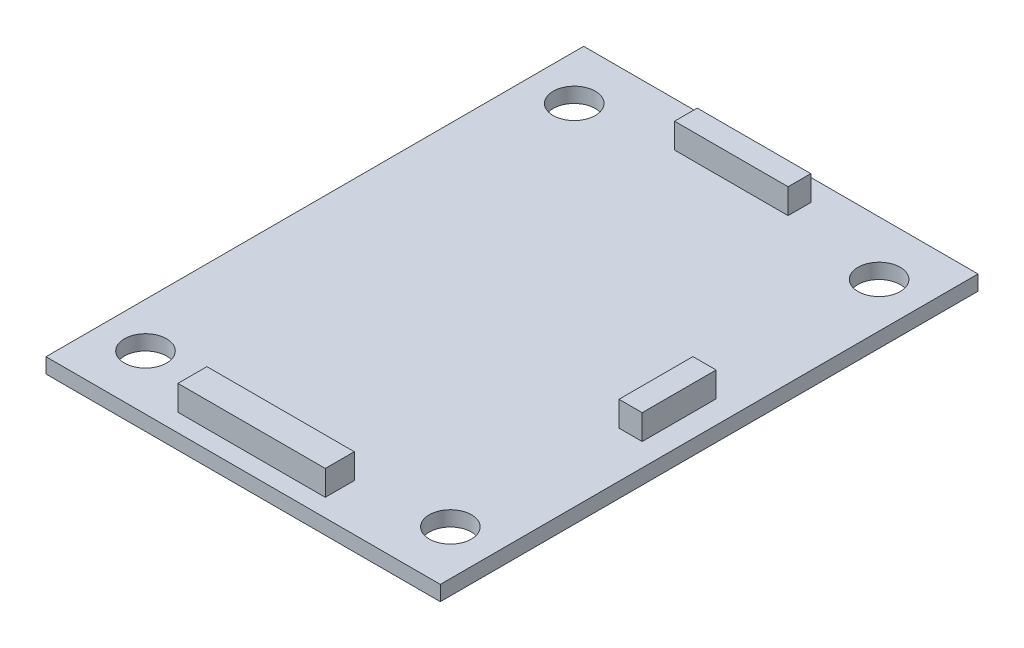
ISO-10303-21;
HEADER;
FILE_DESCRIPTION(('STEP AP214'),'2;1');
FILE_NAME('part.step','',(''),(''),'','','');
FILE_SCHEMA(('AUTOMOTIVE_DESIGN { 1 0 10303 214 1 1 1 1 }'));
ENDSEC;
DATA;
#1=APPLICATION_CONTEXT('core data for automotive mechanical design processes');
#2=APPLICATION_PROTOCOL_DEFINITION('international standard','automotive_design',2000,#1);
#3=PRODUCT_CONTEXT('',#1,'mechanical');
#4=PRODUCT('Part','Part','',(#3));
#5=PRODUCT_RELATED_PRODUCT_CATEGORY('part','',(#4));
#6=PRODUCT_DEFINITION_FORMATION('','',#4);
#7=PRODUCT_DEFINITION_CONTEXT('part definition',#1,'design');
#8=PRODUCT_DEFINITION('design','',#6,#7);
#9=PRODUCT_DEFINITION_SHAPE('','',#8);
#10=(LENGTH_UNIT() NAMED_UNIT(*) SI_UNIT(.MILLI.,.METRE.));
#11=(NAMED_UNIT(*) PLANE_ANGLE_UNIT() SI_UNIT($,.RADIAN.));
#12=(NAMED_UNIT(*) SI_UNIT($,.STERADIAN.) SOLID_ANGLE_UNIT());
#13=UNCERTAINTY_MEASURE_WITH_UNIT(LENGTH_MEASURE(1.E-05),#10,'distance_accuracy_value','');
#14=(GEOMETRIC_REPRESENTATION_CONTEXT(3) GLOBAL_UNCERTAINTY_ASSIGNED_CONTEXT((#13)) GLOBAL_UNIT_ASSIGNED_CONTEXT((#10,
#11,#12)) REPRESENTATION_CONTEXT('',''));
#15=CARTESIAN_POINT('',(0.,0.,0.));
#16=DIRECTION('',(0.,0.,1.));
#17=DIRECTION('',(1.,0.,0.));
#18=AXIS2_PLACEMENT_3D('',#15,#16,#17);
#19=CARTESIAN_POINT('',(0.,1.2,0.));
#20=DIRECTION('',(0.,1.,0.));
#21=DIRECTION('',(0.,0.,1.));
#22=AXIS2_PLACEMENT_3D('',#19,#20,#21);
#23=PLANE('',#22);
#24=CARTESIAN_POINT('',(24.3699999999999,1.2,-34.27));
#25=DIRECTION('',(0.,1.,0.));
#26=DIRECTION('',(0.,0.,1.));
#27=AXIS2_PLACEMENT_3D('',#24,#25,#26);
#28=CIRCLE('',#27,1.685);
#29=CARTESIAN_POINT('',(24.3699999999999,1.2,-32.585));
#30=VERTEX_POINT('',#29);
#31=EDGE_CURVE('E239',#30,#30,#28,.T.);
#32=ORIENTED_EDGE('',*,*,#31,.F.);
#33=EDGE_LOOP('',(#32));
#34=FACE_BOUND('',#33,.T.);
#35=CARTESIAN_POINT('',(0.,1.2,0.));
#36=DIRECTION('',(0.,1.,0.));
#37=DIRECTION('',(0.,0.,1.));
#38=AXIS2_PLACEMENT_3D('',#35,#36,#37);
#39=CIRCLE('',#38,1.685);
#40=CARTESIAN_POINT('',(0.,1.2,1.685));
#41=VERTEX_POINT('',#40);
#42=EDGE_CURVE('E251',#41,#41,#39,.T.);
#43=ORIENTED_EDGE('',*,*,#42,.F.);
#44=EDGE_LOOP('',(#43));
#45=FACE_BOUND('',#44,.T.);
#46=DIRECTION('',(0.,0.,1.));
#47=VECTOR('',#46,1.);
#48=CARTESIAN_POINT('',(-3.57247211098827,1.2,-38.5992559615219));
#49=LINE('',#48,#47);
#50=CARTESIAN_POINT('',(-3.57247211098827,1.2,-38.5992559615219));
#51=VERTEX_POINT('',#50);
#52=CARTESIAN_POINT('',(-3.57247211098827,1.2,4.38050364655458));
#53=VERTEX_POINT('',#52);
#54=EDGE_CURVE('E257',#51,#53,#49,.T.);
#55=ORIENTED_EDGE('',*,*,#54,.T.);
#56=DIRECTION('',(1.,0.,0.));
#57=VECTOR('',#56,1.);
#58=CARTESIAN_POINT('',(-3.57247211098827,1.2,4.38050364655458));
#59=LINE('',#58,#57);
#60=CARTESIAN_POINT('',(27.9460182682678,1.2,4.38050364655458));
#61=VERTEX_POINT('',#60);
#62=EDGE_CURVE('E260',#53,#61,#59,.T.);
#63=ORIENTED_EDGE('',*,*,#62,.T.);
#64=DIRECTION('',(0.,0.,-1.));
#65=VECTOR('',#64,1.);
#66=CARTESIAN_POINT('',(27.9460182682678,1.2,-38.5992559615219));
#67=LINE('',#66,#65);
#68=CARTESIAN_POINT('',(27.9460182682678,1.2,-38.5992559615219));
#69=VERTEX_POINT('',#68);
#70=EDGE_CURVE('E263',#61,#69,#67,.T.);
#71=ORIENTED_EDGE('',*,*,#70,.T.);
#72=DIRECTION('',(-1.,0.,0.));
#73=VECTOR('',#72,1.);
#74=CARTESIAN_POINT('',(-3.57247211098827,1.2,-38.5992559615219));
#75=LINE('',#74,#73);
#76=EDGE_CURVE('E265',#69,#51,#75,.T.);
#77=ORIENTED_EDGE('',*,*,#76,.T.);
#78=EDGE_LOOP('',(#55,#63,#71,#77));
#79=FACE_BOUND('',#78,.T.);
#80=CARTESIAN_POINT('',(24.37,1.2,0.));
#81=DIRECTION('',(0.,1.,0.));
#82=DIRECTION('',(0.,0.,1.));
#83=AXIS2_PLACEMENT_3D('',#80,#81,#82);
#84=CIRCLE('',#83,1.685);
#85=CARTESIAN_POINT('',(24.37,1.2,1.685));
#86=VERTEX_POINT('',#85);
#87=EDGE_CURVE('E245',#86,#86,#84,.T.);
#88=ORIENTED_EDGE('',*,*,#87,.F.);
#89=EDGE_LOOP('',(#88));
#90=FACE_BOUND('',#89,.T.);
#91=CARTESIAN_POINT('',(-1.17554633191815E-13,1.2,-34.27));
#92=DIRECTION('',(0.,1.,0.));
#93=DIRECTION('',(0.,0.,1.));
#94=AXIS2_PLACEMENT_3D('',#91,#92,#93);
#95=CIRCLE('',#94,1.685);
#96=CARTESIAN_POINT('',(-1.17554633191815E-13,1.2,-32.585));
#97=VERTEX_POINT('',#96);
#98=EDGE_CURVE('E233',#97,#97,#95,.T.);
#99=ORIENTED_EDGE('',*,*,#98,.F.);
#100=EDGE_LOOP('',(#99));
#101=FACE_BOUND('',#100,.T.);
#102=DIRECTION('',(1.,0.,0.));
#103=VECTOR('',#102,1.);
#104=CARTESIAN_POINT('',(7.2440065233413,1.2,-35.0462126022973));
#105=LINE('',#104,#103);
#106=CARTESIAN_POINT('',(7.2440065233413,1.2,-35.0462126022973));
#107=VERTEX_POINT('',#106);
#108=CARTESIAN_POINT('',(16.3186169959596,1.2,-35.0462126022973));
#109=VERTEX_POINT('',#108);
#110=EDGE_CURVE('E217',#107,#109,#105,.T.);
#111=ORIENTED_EDGE('',*,*,#110,.F.);
#112=DIRECTION('',(0.,0.,1.));
#113=VECTOR('',#112,1.);
#114=CARTESIAN_POINT('',(7.2440065233413,1.2,-36.861134696821));
#115=LINE('',#114,#113);
#116=CARTESIAN_POINT('',(7.2440065233413,1.2,-36.861134696821));
#117=VERTEX_POINT('',#116);
#118=EDGE_CURVE('E203',#117,#107,#115,.T.);
#119=ORIENTED_EDGE('',*,*,#118,.F.);
#120=DIRECTION('',(-1.,0.,0.));
#121=VECTOR('',#120,1.);
#122=CARTESIAN_POINT('',(7.2440065233413,1.2,-36.861134696821));
#123=LINE('',#122,#121);
#124=CARTESIAN_POINT('',(16.3186169959596,1.2,-36.861134696821));
#125=VERTEX_POINT('',#124);
#126=EDGE_CURVE('E208',#125,#117,#123,.T.);
#127=ORIENTED_EDGE('',*,*,#126,.F.);
#128=DIRECTION('',(0.,0.,-1.));
#129=VECTOR('',#128,1.);
#130=CARTESIAN_POINT('',(16.3186169959596,1.2,-36.861134696821));
#131=LINE('',#130,#129);
#132=EDGE_CURVE('E219',#109,#125,#131,.T.);
#133=ORIENTED_EDGE('',*,*,#132,.F.);
#134=EDGE_LOOP('',(#111,#119,#127,#133));
#135=FACE_BOUND('',#134,.T.);
#136=DIRECTION('',(1.,0.,0.));
#137=VECTOR('',#136,1.);
#138=CARTESIAN_POINT('',(24.2733819208931,1.2,-13.5760703777195));
#139=LINE('',#138,#137);
#140=CARTESIAN_POINT('',(24.2733819208931,1.2,-13.5760703777195));
#141=VERTEX_POINT('',#140);
#142=CARTESIAN_POINT('',(26.12691937913,1.2,-13.5760703777195));
#143=VERTEX_POINT('',#142);
#144=EDGE_CURVE('E175',#141,#143,#139,.T.);
#145=ORIENTED_EDGE('',*,*,#144,.F.);
#146=DIRECTION('',(0.,0.,1.));
#147=VECTOR('',#146,1.);
#148=CARTESIAN_POINT('',(24.2733819208931,1.2,-19.4842210258497));
#149=LINE('',#148,#147);
#150=CARTESIAN_POINT('',(24.2733819208931,1.2,-19.4842210258497));
#151=VERTEX_POINT('',#150);
#152=EDGE_CURVE('E172',#151,#141,#149,.T.);
#153=ORIENTED_EDGE('',*,*,#152,.F.);
#154=DIRECTION('',(-1.,0.,0.));
#155=VECTOR('',#154,1.);
#156=CARTESIAN_POINT('',(24.2733819208931,1.2,-19.4842210258497));
#157=LINE('',#156,#155);
#158=CARTESIAN_POINT('',(26.12691937913,1.2,-19.4842210258497));
#159=VERTEX_POINT('',#158);
#160=EDGE_CURVE('E184',#159,#151,#157,.T.);
#161=ORIENTED_EDGE('',*,*,#160,.F.);
#162=DIRECTION('',(0.,0.,-1.));
#163=VECTOR('',#162,1.);
#164=CARTESIAN_POINT('',(26.12691937913,1.2,-19.4842210258497));
#165=LINE('',#164,#163);
#166=EDGE_CURVE('E192',#143,#159,#165,.T.);
#167=ORIENTED_EDGE('',*,*,#166,.F.);
#168=EDGE_LOOP('',(#145,#153,#161,#167));
#169=FACE_BOUND('',#168,.T.);
#170=DIRECTION('',(1.,0.,0.));
#171=VECTOR('',#170,1.);
#172=CARTESIAN_POINT('',(5.54493051995744,1.2,2.95130529155977));
#173=LINE('',#172,#171);
#174=CARTESIAN_POINT('',(5.54493051995744,1.2,2.95130529155977));
#175=VERTEX_POINT('',#174);
#176=CARTESIAN_POINT('',(17.3226164525046,1.2,2.95130529155977));
#177=VERTEX_POINT('',#176);
#178=EDGE_CURVE('E550',#175,#177,#173,.T.);
#179=ORIENTED_EDGE('',*,*,#178,.F.);
#180=DIRECTION('',(0.,0.,1.));
#181=VECTOR('',#180,1.);
#182=CARTESIAN_POINT('',(5.54493051995744,1.2,0.634383468763609));
#183=LINE('',#182,#181);
#184=CARTESIAN_POINT('',(5.54493051995744,1.2,0.634383468763609));
#185=VERTEX_POINT('',#184);
#186=EDGE_CURVE('E170',#185,#175,#183,.T.);
#187=ORIENTED_EDGE('',*,*,#186,.F.);
#188=DIRECTION('',(-1.,0.,0.));
#189=VECTOR('',#188,1.);
#190=CARTESIAN_POINT('',(5.54493051995744,1.2,0.634383468763609));
#191=LINE('',#190,#189);
#192=CARTESIAN_POINT('',(17.3226164525046,1.2,0.634383468763609));
#193=VERTEX_POINT('',#192);
#194=EDGE_CURVE('E166',#193,#185,#191,.T.);
#195=ORIENTED_EDGE('',*,*,#194,.F.);
#196=DIRECTION('',(0.,0.,-1.));
#197=VECTOR('',#196,1.);
#198=CARTESIAN_POINT('',(17.3226164525046,1.2,0.634383468763609));
#199=LINE('',#198,#197);
#200=EDGE_CURVE('E547',#177,#193,#199,.T.);
#201=ORIENTED_EDGE('',*,*,#200,.F.);
#202=EDGE_LOOP('',(#179,#187,#195,#201));
#203=FACE_BOUND('',#202,.T.);
#204=ADVANCED_FACE('F33',(#34,#45,#79,#90,#101,#135,#169,#203),#23,.T.);
#205=CARTESIAN_POINT('',(0.,0.,0.));
#206=DIRECTION('',(0.,1.,0.));
#207=DIRECTION('',(0.,0.,1.));
#208=AXIS2_PLACEMENT_3D('',#205,#206,#207);
#209=PLANE('',#208);
#210=DIRECTION('',(0.,0.,1.));
#211=VECTOR('',#210,1.);
#212=CARTESIAN_POINT('',(-3.57247211098827,0.,-38.5992559615219));
#213=LINE('',#212,#211);
#214=CARTESIAN_POINT('',(-3.57247211098827,0.,-38.5992559615219));
#215=VERTEX_POINT('',#214);
#216=CARTESIAN_POINT('',(-3.57247211098827,0.,4.38050364655458));
#217=VERTEX_POINT('',#216);
#218=EDGE_CURVE('E254',#215,#217,#213,.T.);
#219=ORIENTED_EDGE('',*,*,#218,.F.);
#220=DIRECTION('',(-1.,0.,0.));
#221=VECTOR('',#220,1.);
#222=CARTESIAN_POINT('',(-3.57247211098827,0.,-38.5992559615219));
#223=LINE('',#222,#221);
#224=CARTESIAN_POINT('',(27.9460182682678,0.,-38.5992559615219));
#225=VERTEX_POINT('',#224);
#226=EDGE_CURVE('E261',#225,#215,#223,.T.);
#227=ORIENTED_EDGE('',*,*,#226,.F.);
#228=DIRECTION('',(0.,0.,-1.));
#229=VECTOR('',#228,1.);
#230=CARTESIAN_POINT('',(27.9460182682678,0.,-38.5992559615219));
#231=LINE('',#230,#229);
#232=CARTESIAN_POINT('',(27.9460182682678,0.,4.38050364655458));
#233=VERTEX_POINT('',#232);
#234=EDGE_CURVE('E272',#233,#225,#231,.T.);
#235=ORIENTED_EDGE('',*,*,#234,.F.);
#236=DIRECTION('',(1.,0.,0.));
#237=VECTOR('',#236,1.);
#238=CARTESIAN_POINT('',(-3.57247211098827,0.,4.38050364655458));
#239=LINE('',#238,#237);
#240=EDGE_CURVE('E270',#217,#233,#239,.T.);
#241=ORIENTED_EDGE('',*,*,#240,.F.);
#242=EDGE_LOOP('',(#219,#227,#235,#241));
#243=FACE_BOUND('',#242,.T.);
#244=CARTESIAN_POINT('',(0.,0.,0.));
#245=DIRECTION('',(0.,1.,0.));
#246=DIRECTION('',(0.,0.,1.));
#247=AXIS2_PLACEMENT_3D('',#244,#245,#246);
#248=CIRCLE('',#247,1.685);
#249=CARTESIAN_POINT('',(0.,0.,1.685));
#250=VERTEX_POINT('',#249);
#251=EDGE_CURVE('E248',#250,#250,#248,.T.);
#252=ORIENTED_EDGE('',*,*,#251,.T.);
#253=EDGE_LOOP('',(#252));
#254=FACE_BOUND('',#253,.T.);
#255=CARTESIAN_POINT('',(24.37,0.,0.));
#256=DIRECTION('',(0.,1.,0.));
#257=DIRECTION('',(0.,0.,1.));
#258=AXIS2_PLACEMENT_3D('',#255,#256,#257);
#259=CIRCLE('',#258,1.685);
#260=CARTESIAN_POINT('',(24.37,0.,1.685));
#261=VERTEX_POINT('',#260);
#262=EDGE_CURVE('E242',#261,#261,#259,.T.);
#263=ORIENTED_EDGE('',*,*,#262,.T.);
#264=EDGE_LOOP('',(#263));
#265=FACE_BOUND('',#264,.T.);
#266=CARTESIAN_POINT('',(24.3699999999999,0.,-34.27));
#267=DIRECTION('',(0.,1.,0.));
#268=DIRECTION('',(0.,0.,1.));
#269=AXIS2_PLACEMENT_3D('',#266,#267,#268);
#270=CIRCLE('',#269,1.685);
#271=CARTESIAN_POINT('',(24.3699999999999,0.,-32.585));
#272=VERTEX_POINT('',#271);
#273=EDGE_CURVE('E236',#272,#272,#270,.T.);
#274=ORIENTED_EDGE('',*,*,#273,.T.);
#275=EDGE_LOOP('',(#274));
#276=FACE_BOUND('',#275,.T.);
#277=CARTESIAN_POINT('',(-1.17554633191815E-13,0.,-34.27));
#278=DIRECTION('',(0.,1.,0.));
#279=DIRECTION('',(0.,0.,1.));
#280=AXIS2_PLACEMENT_3D('',#277,#278,#279);
#281=CIRCLE('',#280,1.685);
#282=CARTESIAN_POINT('',(-1.17554633191815E-13,0.,-32.585));
#283=VERTEX_POINT('',#282);
#284=EDGE_CURVE('E232',#283,#283,#281,.T.);
#285=ORIENTED_EDGE('',*,*,#284,.T.);
#286=EDGE_LOOP('',(#285));
#287=FACE_BOUND('',#286,.T.);
#288=ADVANCED_FACE('F290',(#243,#254,#265,#276,#287),#209,.F.);
#289=CARTESIAN_POINT('',(-3.57247211098827,1.2,-38.5992559615219));
#290=DIRECTION('',(1.,0.,0.));
#291=DIRECTION('',(0.,0.,-1.));
#292=AXIS2_PLACEMENT_3D('',#289,#290,#291);
#293=PLANE('',#292);
#294=ORIENTED_EDGE('',*,*,#218,.T.);
#295=DIRECTION('',(0.,-1.,0.));
#296=VECTOR('',#295,1.);
#297=CARTESIAN_POINT('',(-3.57247211098827,1.2,4.38050364655458));
#298=LINE('',#297,#296);
#299=EDGE_CURVE('E11',#53,#217,#298,.T.);
#300=ORIENTED_EDGE('',*,*,#299,.F.);
#301=ORIENTED_EDGE('',*,*,#54,.F.);
#302=DIRECTION('',(0.,-1.,0.));
#303=VECTOR('',#302,1.);
#304=CARTESIAN_POINT('',(-3.57247211098827,1.2,-38.5992559615219));
#305=LINE('',#304,#303);
#306=EDGE_CURVE('E267',#51,#215,#305,.T.);
#307=ORIENTED_EDGE('',*,*,#306,.T.);
#308=EDGE_LOOP('',(#294,#300,#301,#307));
#309=FACE_BOUND('',#308,.T.);
#310=ADVANCED_FACE('F35',(#309),#293,.F.);
#311=CARTESIAN_POINT('',(-3.57247211098827,1.2,4.38050364655458));
#312=DIRECTION('',(0.,0.,-1.));
#313=DIRECTION('',(-1.,0.,0.));
#314=AXIS2_PLACEMENT_3D('',#311,#312,#313);
#315=PLANE('',#314);
#316=ORIENTED_EDGE('',*,*,#240,.T.);
#317=DIRECTION('',(0.,-1.,0.));
#318=VECTOR('',#317,1.);
#319=CARTESIAN_POINT('',(27.9460182682678,1.2,4.38050364655458));
#320=LINE('',#319,#318);
#321=EDGE_CURVE('E41',#61,#233,#320,.T.);
#322=ORIENTED_EDGE('',*,*,#321,.F.);
#323=ORIENTED_EDGE('',*,*,#62,.F.);
#324=ORIENTED_EDGE('',*,*,#299,.T.);
#325=EDGE_LOOP('',(#316,#322,#323,#324));
#326=FACE_BOUND('',#325,.T.);
#327=ADVANCED_FACE('F301',(#326),#315,.F.);
#328=CARTESIAN_POINT('',(27.9460182682678,1.2,-38.5992559615219));
#329=DIRECTION('',(-1.,0.,0.));
#330=DIRECTION('',(0.,0.,1.));
#331=AXIS2_PLACEMENT_3D('',#328,#329,#330);
#332=PLANE('',#331);
#333=ORIENTED_EDGE('',*,*,#234,.T.);
#334=DIRECTION('',(0.,-1.,0.));
#335=VECTOR('',#334,1.);
#336=CARTESIAN_POINT('',(27.9460182682678,1.2,-38.5992559615219));
#337=LINE('',#336,#335);
#338=EDGE_CURVE('E277',#69,#225,#337,.T.);
#339=ORIENTED_EDGE('',*,*,#338,.F.);
#340=ORIENTED_EDGE('',*,*,#70,.F.);
#341=ORIENTED_EDGE('',*,*,#321,.T.);
#342=EDGE_LOOP('',(#333,#339,#340,#341));
#343=FACE_BOUND('',#342,.T.);
#344=ADVANCED_FACE('F284',(#343),#332,.F.);
#345=CARTESIAN_POINT('',(-3.57247211098827,1.2,-38.5992559615219));
#346=DIRECTION('',(0.,0.,1.));
#347=DIRECTION('',(1.,0.,0.));
#348=AXIS2_PLACEMENT_3D('',#345,#346,#347);
#349=PLANE('',#348);
#350=ORIENTED_EDGE('',*,*,#226,.T.);
#351=ORIENTED_EDGE('',*,*,#306,.F.);
#352=ORIENTED_EDGE('',*,*,#76,.F.);
#353=ORIENTED_EDGE('',*,*,#338,.T.);
#354=EDGE_LOOP('',(#350,#351,#352,#353));
#355=FACE_BOUND('',#354,.T.);
#356=ADVANCED_FACE('F294',(#355),#349,.F.);
#357=CARTESIAN_POINT('',(0.,1.2,0.));
#358=DIRECTION('',(0.,-1.,0.));
#359=DIRECTION('',(0.,0.,-1.));
#360=AXIS2_PLACEMENT_3D('',#357,#358,#359);
#361=CYLINDRICAL_SURFACE('',#360,1.685);
#362=ORIENTED_EDGE('',*,*,#42,.T.);
#363=EDGE_LOOP('',(#362));
#364=FACE_BOUND('',#363,.T.);
#365=ORIENTED_EDGE('',*,*,#251,.F.);
#366=EDGE_LOOP('',(#365));
#367=FACE_BOUND('',#366,.T.);
#368=ADVANCED_FACE('F318',(#364,#367),#361,.F.);
#369=CARTESIAN_POINT('',(24.37,1.2,0.));
#370=DIRECTION('',(0.,-1.,0.));
#371=DIRECTION('',(0.,0.,-1.));
#372=AXIS2_PLACEMENT_3D('',#369,#370,#371);
#373=CYLINDRICAL_SURFACE('',#372,1.685);
#374=ORIENTED_EDGE('',*,*,#87,.T.);
#375=EDGE_LOOP('',(#374));
#376=FACE_BOUND('',#375,.T.);
#377=ORIENTED_EDGE('',*,*,#262,.F.);
#378=EDGE_LOOP('',(#377));
#379=FACE_BOUND('',#378,.T.);
#380=ADVANCED_FACE('F325',(#376,#379),#373,.F.);
#381=CARTESIAN_POINT('',(24.3699999999999,1.2,-34.27));
#382=DIRECTION('',(0.,-1.,0.));
#383=DIRECTION('',(0.,0.,-1.));
#384=AXIS2_PLACEMENT_3D('',#381,#382,#383);
#385=CYLINDRICAL_SURFACE('',#384,1.685);
#386=ORIENTED_EDGE('',*,*,#31,.T.);
#387=EDGE_LOOP('',(#386));
#388=FACE_BOUND('',#387,.T.);
#389=ORIENTED_EDGE('',*,*,#273,.F.);
#390=EDGE_LOOP('',(#389));
#391=FACE_BOUND('',#390,.T.);
#392=ADVANCED_FACE('F330',(#388,#391),#385,.F.);
#393=CARTESIAN_POINT('',(-1.17554633191815E-13,1.2,-34.27));
#394=DIRECTION('',(0.,-1.,0.));
#395=DIRECTION('',(0.,0.,-1.));
#396=AXIS2_PLACEMENT_3D('',#393,#394,#395);
#397=CYLINDRICAL_SURFACE('',#396,1.685);
#398=ORIENTED_EDGE('',*,*,#98,.T.);
#399=EDGE_LOOP('',(#398));
#400=FACE_BOUND('',#399,.T.);
#401=ORIENTED_EDGE('',*,*,#284,.F.);
#402=EDGE_LOOP('',(#401));
#403=FACE_BOUND('',#402,.T.);
#404=ADVANCED_FACE('F342',(#400,#403),#397,.F.);
#405=CARTESIAN_POINT('',(7.2440065233413,3.2,-36.861134696821));
#406=DIRECTION('',(1.,0.,0.));
#407=DIRECTION('',(0.,0.,-1.));
#408=AXIS2_PLACEMENT_3D('',#405,#406,#407);
#409=PLANE('',#408);
#410=ORIENTED_EDGE('',*,*,#118,.T.);
#411=DIRECTION('',(0.,-1.,0.));
#412=VECTOR('',#411,1.);
#413=CARTESIAN_POINT('',(7.2440065233413,3.2,-35.0462126022973));
#414=LINE('',#413,#412);
#415=CARTESIAN_POINT('',(7.2440065233413,3.2,-35.0462126022973));
#416=VERTEX_POINT('',#415);
#417=EDGE_CURVE('E230',#416,#107,#414,.T.);
#418=ORIENTED_EDGE('',*,*,#417,.F.);
#419=DIRECTION('',(0.,0.,1.));
#420=VECTOR('',#419,1.);
#421=CARTESIAN_POINT('',(7.2440065233413,3.2,-36.861134696821));
#422=LINE('',#421,#420);
#423=CARTESIAN_POINT('',(7.2440065233413,3.2,-36.861134696821));
#424=VERTEX_POINT('',#423);
#425=EDGE_CURVE('E204',#424,#416,#422,.T.);
#426=ORIENTED_EDGE('',*,*,#425,.F.);
#427=DIRECTION('',(0.,-1.,0.));
#428=VECTOR('',#427,1.);
#429=CARTESIAN_POINT('',(7.2440065233413,3.2,-36.861134696821));
#430=LINE('',#429,#428);
#431=EDGE_CURVE('E214',#424,#117,#430,.T.);
#432=ORIENTED_EDGE('',*,*,#431,.T.);
#433=EDGE_LOOP('',(#410,#418,#426,#432));
#434=FACE_BOUND('',#433,.T.);
#435=ADVANCED_FACE('F344',(#434),#409,.F.);
#436=CARTESIAN_POINT('',(7.2440065233413,3.2,-35.0462126022973));
#437=DIRECTION('',(0.,0.,-1.));
#438=DIRECTION('',(-1.,0.,0.));
#439=AXIS2_PLACEMENT_3D('',#436,#437,#438);
#440=PLANE('',#439);
#441=ORIENTED_EDGE('',*,*,#110,.T.);
#442=DIRECTION('',(0.,-1.,0.));
#443=VECTOR('',#442,1.);
#444=CARTESIAN_POINT('',(16.3186169959596,3.2,-35.0462126022973));
#445=LINE('',#444,#443);
#446=CARTESIAN_POINT('',(16.3186169959596,3.2,-35.0462126022973));
#447=VERTEX_POINT('',#446);
#448=EDGE_CURVE('E227',#447,#109,#445,.T.);
#449=ORIENTED_EDGE('',*,*,#448,.F.);
#450=DIRECTION('',(1.,0.,0.));
#451=VECTOR('',#450,1.);
#452=CARTESIAN_POINT('',(7.2440065233413,3.2,-35.0462126022973));
#453=LINE('',#452,#451);
#454=EDGE_CURVE('E207',#416,#447,#453,.T.);
#455=ORIENTED_EDGE('',*,*,#454,.F.);
#456=ORIENTED_EDGE('',*,*,#417,.T.);
#457=EDGE_LOOP('',(#441,#449,#455,#456));
#458=FACE_BOUND('',#457,.T.);
#459=ADVANCED_FACE('F351',(#458),#440,.F.);
#460=CARTESIAN_POINT('',(16.3186169959596,3.2,-36.861134696821));
#461=DIRECTION('',(-1.,0.,0.));
#462=DIRECTION('',(0.,0.,1.));
#463=AXIS2_PLACEMENT_3D('',#460,#461,#462);
#464=PLANE('',#463);
#465=ORIENTED_EDGE('',*,*,#132,.T.);
#466=DIRECTION('',(0.,-1.,0.));
#467=VECTOR('',#466,1.);
#468=CARTESIAN_POINT('',(16.3186169959596,3.2,-36.861134696821));
#469=LINE('',#468,#467);
#470=CARTESIAN_POINT('',(16.3186169959596,3.2,-36.861134696821));
#471=VERTEX_POINT('',#470);
#472=EDGE_CURVE('E225',#471,#125,#469,.T.);
#473=ORIENTED_EDGE('',*,*,#472,.F.);
#474=DIRECTION('',(0.,0.,-1.));
#475=VECTOR('',#474,1.);
#476=CARTESIAN_POINT('',(16.3186169959596,3.2,-36.861134696821));
#477=LINE('',#476,#475);
#478=EDGE_CURVE('E210',#447,#471,#477,.T.);
#479=ORIENTED_EDGE('',*,*,#478,.F.);
#480=ORIENTED_EDGE('',*,*,#448,.T.);
#481=EDGE_LOOP('',(#465,#473,#479,#480));
#482=FACE_BOUND('',#481,.T.);
#483=ADVANCED_FACE('F359',(#482),#464,.F.);
#484=CARTESIAN_POINT('',(7.2440065233413,3.2,-36.861134696821));
#485=DIRECTION('',(0.,0.,1.));
#486=DIRECTION('',(1.,0.,0.));
#487=AXIS2_PLACEMENT_3D('',#484,#485,#486);
#488=PLANE('',#487);
#489=ORIENTED_EDGE('',*,*,#126,.T.);
#490=ORIENTED_EDGE('',*,*,#431,.F.);
#491=DIRECTION('',(-1.,0.,0.));
#492=VECTOR('',#491,1.);
#493=CARTESIAN_POINT('',(7.2440065233413,3.2,-36.861134696821));
#494=LINE('',#493,#492);
#495=EDGE_CURVE('E212',#471,#424,#494,.T.);
#496=ORIENTED_EDGE('',*,*,#495,.F.);
#497=ORIENTED_EDGE('',*,*,#472,.T.);
#498=EDGE_LOOP('',(#489,#490,#496,#497));
#499=FACE_BOUND('',#498,.T.);
#500=ADVANCED_FACE('F363',(#499),#488,.F.);
#501=CARTESIAN_POINT('',(0.,3.2,0.));
#502=DIRECTION('',(0.,1.,0.));
#503=DIRECTION('',(0.,0.,1.));
#504=AXIS2_PLACEMENT_3D('',#501,#502,#503);
#505=PLANE('',#504);
#506=ORIENTED_EDGE('',*,*,#425,.T.);
#507=ORIENTED_EDGE('',*,*,#454,.T.);
#508=ORIENTED_EDGE('',*,*,#478,.T.);
#509=ORIENTED_EDGE('',*,*,#495,.T.);
#510=EDGE_LOOP('',(#506,#507,#508,#509));
#511=FACE_BOUND('',#510,.T.);
#512=ADVANCED_FACE('F367',(#511),#505,.T.);
#513=CARTESIAN_POINT('',(24.2733819208931,3.2,-19.4842210258497));
#514=DIRECTION('',(1.,0.,0.));
#515=DIRECTION('',(0.,0.,-1.));
#516=AXIS2_PLACEMENT_3D('',#513,#514,#515);
#517=PLANE('',#516);
#518=ORIENTED_EDGE('',*,*,#152,.T.);
#519=DIRECTION('',(0.,-1.,0.));
#520=VECTOR('',#519,1.);
#521=CARTESIAN_POINT('',(24.2733819208931,3.2,-13.5760703777195));
#522=LINE('',#521,#520);
#523=CARTESIAN_POINT('',(24.2733819208931,3.2,-13.5760703777195));
#524=VERTEX_POINT('',#523);
#525=EDGE_CURVE('E201',#524,#141,#522,.T.);
#526=ORIENTED_EDGE('',*,*,#525,.F.);
#527=DIRECTION('',(0.,0.,1.));
#528=VECTOR('',#527,1.);
#529=CARTESIAN_POINT('',(24.2733819208931,3.2,-19.4842210258497));
#530=LINE('',#529,#528);
#531=CARTESIAN_POINT('',(24.2733819208931,3.2,-19.4842210258497));
#532=VERTEX_POINT('',#531);
#533=EDGE_CURVE('E180',#532,#524,#530,.T.);
#534=ORIENTED_EDGE('',*,*,#533,.F.);
#535=DIRECTION('',(0.,-1.,0.));
#536=VECTOR('',#535,1.);
#537=CARTESIAN_POINT('',(24.2733819208931,3.2,-19.4842210258497));
#538=LINE('',#537,#536);
#539=EDGE_CURVE('E189',#532,#151,#538,.T.);
#540=ORIENTED_EDGE('',*,*,#539,.T.);
#541=EDGE_LOOP('',(#518,#526,#534,#540));
#542=FACE_BOUND('',#541,.T.);
#543=ADVANCED_FACE('F371',(#542),#517,.F.);
#544=CARTESIAN_POINT('',(24.2733819208931,3.2,-13.5760703777195));
#545=DIRECTION('',(0.,0.,-1.));
#546=DIRECTION('',(-1.,0.,0.));
#547=AXIS2_PLACEMENT_3D('',#544,#545,#546);
#548=PLANE('',#547);
#549=ORIENTED_EDGE('',*,*,#144,.T.);
#550=DIRECTION('',(0.,-1.,0.));
#551=VECTOR('',#550,1.);
#552=CARTESIAN_POINT('',(26.12691937913,3.2,-13.5760703777195));
#553=LINE('',#552,#551);
#554=CARTESIAN_POINT('',(26.12691937913,3.2,-13.5760703777195));
#555=VERTEX_POINT('',#554);
#556=EDGE_CURVE('E198',#555,#143,#553,.T.);
#557=ORIENTED_EDGE('',*,*,#556,.F.);
#558=DIRECTION('',(1.,0.,0.));
#559=VECTOR('',#558,1.);
#560=CARTESIAN_POINT('',(24.2733819208931,3.2,-13.5760703777195));
#561=LINE('',#560,#559);
#562=EDGE_CURVE('E183',#524,#555,#561,.T.);
#563=ORIENTED_EDGE('',*,*,#562,.F.);
#564=ORIENTED_EDGE('',*,*,#525,.T.);
#565=EDGE_LOOP('',(#549,#557,#563,#564));
#566=FACE_BOUND('',#565,.T.);
#567=ADVANCED_FACE('F375',(#566),#548,.F.);
#568=CARTESIAN_POINT('',(26.12691937913,3.2,-19.4842210258497));
#569=DIRECTION('',(-1.,0.,0.));
#570=DIRECTION('',(0.,0.,1.));
#571=AXIS2_PLACEMENT_3D('',#568,#569,#570);
#572=PLANE('',#571);
#573=ORIENTED_EDGE('',*,*,#166,.T.);
#574=DIRECTION('',(0.,-1.,0.));
#575=VECTOR('',#574,1.);
#576=CARTESIAN_POINT('',(26.12691937913,3.2,-19.4842210258497));
#577=LINE('',#576,#575);
#578=CARTESIAN_POINT('',(26.12691937913,3.2,-19.4842210258497));
#579=VERTEX_POINT('',#578);
#580=EDGE_CURVE('E56',#579,#159,#577,.T.);
#581=ORIENTED_EDGE('',*,*,#580,.F.);
#582=DIRECTION('',(0.,0.,-1.));
#583=VECTOR('',#582,1.);
#584=CARTESIAN_POINT('',(26.12691937913,3.2,-19.4842210258497));
#585=LINE('',#584,#583);
#586=EDGE_CURVE('E186',#555,#579,#585,.T.);
#587=ORIENTED_EDGE('',*,*,#586,.F.);
#588=ORIENTED_EDGE('',*,*,#556,.T.);
#589=EDGE_LOOP('',(#573,#581,#587,#588));
#590=FACE_BOUND('',#589,.T.);
#591=ADVANCED_FACE('F379',(#590),#572,.F.);
#592=CARTESIAN_POINT('',(24.2733819208931,3.2,-19.4842210258497));
#593=DIRECTION('',(0.,0.,1.));
#594=DIRECTION('',(1.,0.,0.));
#595=AXIS2_PLACEMENT_3D('',#592,#593,#594);
#596=PLANE('',#595);
#597=ORIENTED_EDGE('',*,*,#160,.T.);
#598=ORIENTED_EDGE('',*,*,#539,.F.);
#599=DIRECTION('',(-1.,0.,0.));
#600=VECTOR('',#599,1.);
#601=CARTESIAN_POINT('',(24.2733819208931,3.2,-19.4842210258497));
#602=LINE('',#601,#600);
#603=EDGE_CURVE('E188',#579,#532,#602,.T.);
#604=ORIENTED_EDGE('',*,*,#603,.F.);
#605=ORIENTED_EDGE('',*,*,#580,.T.);
#606=EDGE_LOOP('',(#597,#598,#604,#605));
#607=FACE_BOUND('',#606,.T.);
#608=ADVANCED_FACE('F383',(#607),#596,.F.);
#609=CARTESIAN_POINT('',(0.,3.2,0.));
#610=DIRECTION('',(0.,1.,0.));
#611=DIRECTION('',(0.,0.,1.));
#612=AXIS2_PLACEMENT_3D('',#609,#610,#611);
#613=PLANE('',#612);
#614=ORIENTED_EDGE('',*,*,#533,.T.);
#615=ORIENTED_EDGE('',*,*,#562,.T.);
#616=ORIENTED_EDGE('',*,*,#586,.T.);
#617=ORIENTED_EDGE('',*,*,#603,.T.);
#618=EDGE_LOOP('',(#614,#615,#616,#617));
#619=FACE_BOUND('',#618,.T.);
#620=ADVANCED_FACE('F387',(#619),#613,.T.);
#621=CARTESIAN_POINT('',(5.54493051995744,3.2,0.634383468763609));
#622=DIRECTION('',(1.,0.,0.));
#623=DIRECTION('',(0.,0.,-1.));
#624=AXIS2_PLACEMENT_3D('',#621,#622,#623);
#625=PLANE('',#624);
#626=ORIENTED_EDGE('',*,*,#186,.T.);
#627=DIRECTION('',(0.,-1.,0.));
#628=VECTOR('',#627,1.);
#629=CARTESIAN_POINT('',(5.54493051995744,3.2,2.95130529155977));
#630=LINE('',#629,#628);
#631=CARTESIAN_POINT('',(5.54493051995744,3.2,2.95130529155977));
#632=VERTEX_POINT('',#631);
#633=EDGE_CURVE('E151',#632,#175,#630,.T.);
#634=ORIENTED_EDGE('',*,*,#633,.F.);
#635=DIRECTION('',(0.,0.,1.));
#636=VECTOR('',#635,1.);
#637=CARTESIAN_POINT('',(5.54493051995744,3.2,0.634383468763609));
#638=LINE('',#637,#636);
#639=CARTESIAN_POINT('',(5.54493051995744,3.2,0.634383468763609));
#640=VERTEX_POINT('',#639);
#641=EDGE_CURVE('E158',#640,#632,#638,.T.);
#642=ORIENTED_EDGE('',*,*,#641,.F.);
#643=DIRECTION('',(0.,-1.,0.));
#644=VECTOR('',#643,1.);
#645=CARTESIAN_POINT('',(5.54493051995744,3.2,0.634383468763609));
#646=LINE('',#645,#644);
#647=EDGE_CURVE('E544',#640,#185,#646,.T.);
#648=ORIENTED_EDGE('',*,*,#647,.T.);
#649=EDGE_LOOP('',(#626,#634,#642,#648));
#650=FACE_BOUND('',#649,.T.);
#651=ADVANCED_FACE('F168',(#650),#625,.F.);
#652=CARTESIAN_POINT('',(5.54493051995744,3.2,2.95130529155977));
#653=DIRECTION('',(0.,0.,-1.));
#654=DIRECTION('',(-1.,0.,0.));
#655=AXIS2_PLACEMENT_3D('',#652,#653,#654);
#656=PLANE('',#655);
#657=ORIENTED_EDGE('',*,*,#178,.T.);
#658=DIRECTION('',(0.,-1.,0.));
#659=VECTOR('',#658,1.);
#660=CARTESIAN_POINT('',(17.3226164525046,3.2,2.95130529155977));
#661=LINE('',#660,#659);
#662=CARTESIAN_POINT('',(17.3226164525046,3.2,2.95130529155977));
#663=VERTEX_POINT('',#662);
#664=EDGE_CURVE('E154',#663,#177,#661,.T.);
#665=ORIENTED_EDGE('',*,*,#664,.F.);
#666=DIRECTION('',(1.,0.,0.));
#667=VECTOR('',#666,1.);
#668=CARTESIAN_POINT('',(5.54493051995744,3.2,2.95130529155977));
#669=LINE('',#668,#667);
#670=EDGE_CURVE('E147',#632,#663,#669,.T.);
#671=ORIENTED_EDGE('',*,*,#670,.F.);
#672=ORIENTED_EDGE('',*,*,#633,.T.);
#673=EDGE_LOOP('',(#657,#665,#671,#672));
#674=FACE_BOUND('',#673,.T.);
#675=ADVANCED_FACE('F149',(#674),#656,.F.);
#676=CARTESIAN_POINT('',(17.3226164525046,3.2,0.634383468763609));
#677=DIRECTION('',(-1.,0.,0.));
#678=DIRECTION('',(0.,0.,1.));
#679=AXIS2_PLACEMENT_3D('',#676,#677,#678);
#680=PLANE('',#679);
#681=ORIENTED_EDGE('',*,*,#200,.T.);
#682=DIRECTION('',(0.,-1.,0.));
#683=VECTOR('',#682,1.);
#684=CARTESIAN_POINT('',(17.3226164525046,3.2,0.634383468763609));
#685=LINE('',#684,#683);
#686=CARTESIAN_POINT('',(17.3226164525046,3.2,0.634383468763609));
#687=VERTEX_POINT('',#686);
#688=EDGE_CURVE('E48',#687,#193,#685,.T.);
#689=ORIENTED_EDGE('',*,*,#688,.F.);
#690=DIRECTION('',(0.,0.,-1.));
#691=VECTOR('',#690,1.);
#692=CARTESIAN_POINT('',(17.3226164525046,3.2,0.634383468763609));
#693=LINE('',#692,#691);
#694=EDGE_CURVE('E157',#663,#687,#693,.T.);
#695=ORIENTED_EDGE('',*,*,#694,.F.);
#696=ORIENTED_EDGE('',*,*,#664,.T.);
#697=EDGE_LOOP('',(#681,#689,#695,#696));
#698=FACE_BOUND('',#697,.T.);
#699=ADVANCED_FACE('F395',(#698),#680,.F.);
#700=CARTESIAN_POINT('',(5.54493051995744,3.2,0.634383468763609));
#701=DIRECTION('',(0.,0.,1.));
#702=DIRECTION('',(1.,0.,0.));
#703=AXIS2_PLACEMENT_3D('',#700,#701,#702);
#704=PLANE('',#703);
#705=ORIENTED_EDGE('',*,*,#194,.T.);
#706=ORIENTED_EDGE('',*,*,#647,.F.);
#707=DIRECTION('',(-1.,0.,0.));
#708=VECTOR('',#707,1.);
#709=CARTESIAN_POINT('',(5.54493051995744,3.2,0.634383468763609));
#710=LINE('',#709,#708);
#711=EDGE_CURVE('E162',#687,#640,#710,.T.);
#712=ORIENTED_EDGE('',*,*,#711,.F.);
#713=ORIENTED_EDGE('',*,*,#688,.T.);
#714=EDGE_LOOP('',(#705,#706,#712,#713));
#715=FACE_BOUND('',#714,.T.);
#716=ADVANCED_FACE('F398',(#715),#704,.F.);
#717=CARTESIAN_POINT('',(0.,3.2,0.));
#718=DIRECTION('',(0.,1.,0.));
#719=DIRECTION('',(0.,0.,1.));
#720=AXIS2_PLACEMENT_3D('',#717,#718,#719);
#721=PLANE('',#720);
#722=ORIENTED_EDGE('',*,*,#641,.T.);
#723=ORIENTED_EDGE('',*,*,#670,.T.);
#724=ORIENTED_EDGE('',*,*,#694,.T.);
#725=ORIENTED_EDGE('',*,*,#711,.T.);
#726=EDGE_LOOP('',(#722,#723,#724,#725));
#727=FACE_BOUND('',#726,.T.);
#728=ADVANCED_FACE('F161',(#727),#721,.T.);
#729=CLOSED_SHELL('',(#204,#288,#310,#327,#344,#356,#368,#380,#392,#404,#435,#459,#483,#500,
#512,#543,#567,#591,#608,#620,#651,#675,#699,#716,#728));
#730=MANIFOLD_SOLID_BREP('B2',#729);
#731=ADVANCED_BREP_SHAPE_REPRESENTATION('',(#18,#730),#14);
#732=SHAPE_DEFINITION_REPRESENTATION(#9,#731);
ENDSEC;
END-ISO-10303-21;
